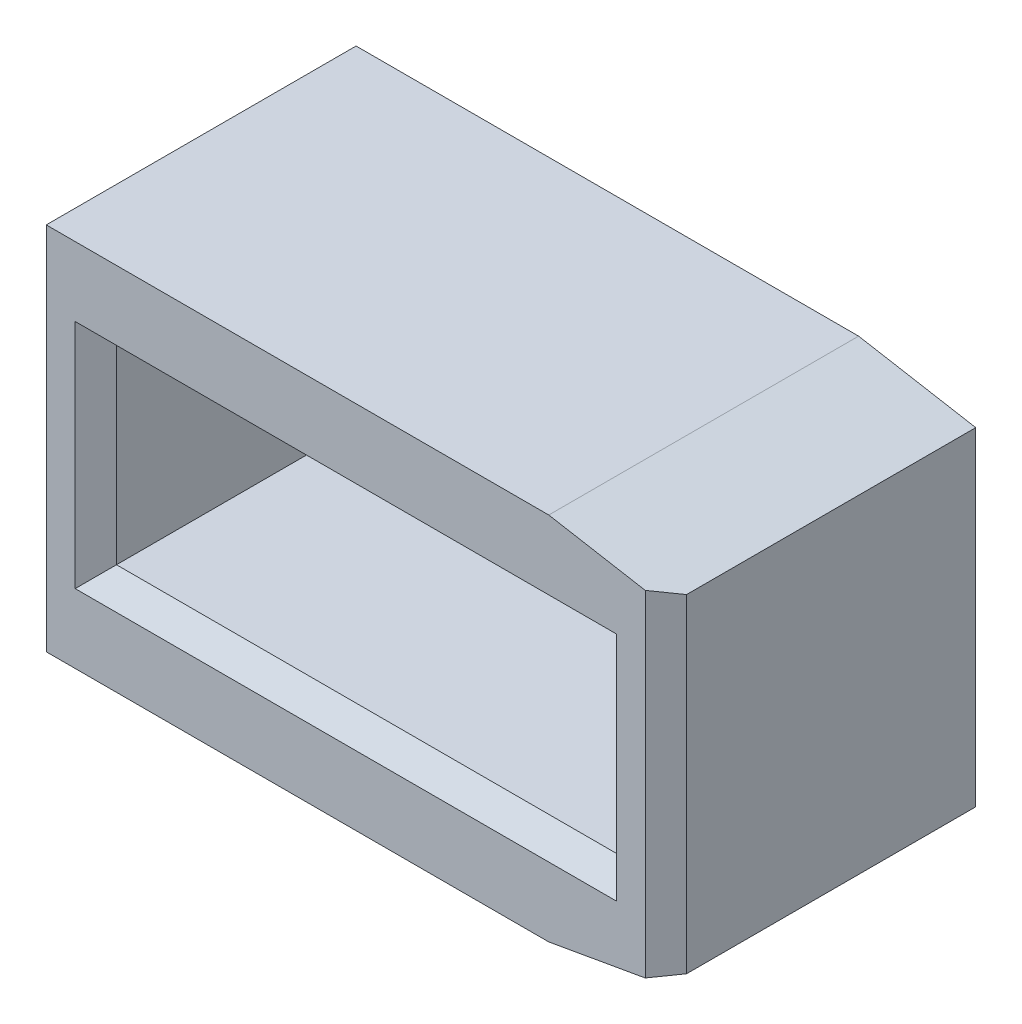
ISO-10303-21;
HEADER;
FILE_DESCRIPTION(('STEP AP214'),'2;1');
FILE_NAME('part.step','',(''),(''),'','','');
FILE_SCHEMA(('AUTOMOTIVE_DESIGN { 1 0 10303 214 1 1 1 1 }'));
ENDSEC;
DATA;
#1=APPLICATION_CONTEXT('core data for automotive mechanical design processes');
#2=APPLICATION_PROTOCOL_DEFINITION('international standard','automotive_design',2000,#1);
#3=PRODUCT_CONTEXT('',#1,'mechanical');
#4=PRODUCT('Part','Part','',(#3));
#5=PRODUCT_RELATED_PRODUCT_CATEGORY('part','',(#4));
#6=PRODUCT_DEFINITION_FORMATION('','',#4);
#7=PRODUCT_DEFINITION_CONTEXT('part definition',#1,'design');
#8=PRODUCT_DEFINITION('design','',#6,#7);
#9=PRODUCT_DEFINITION_SHAPE('','',#8);
#10=(LENGTH_UNIT() NAMED_UNIT(*) SI_UNIT(.MILLI.,.METRE.));
#11=(NAMED_UNIT(*) PLANE_ANGLE_UNIT() SI_UNIT($,.RADIAN.));
#12=(NAMED_UNIT(*) SI_UNIT($,.STERADIAN.) SOLID_ANGLE_UNIT());
#13=UNCERTAINTY_MEASURE_WITH_UNIT(LENGTH_MEASURE(1.E-05),#10,'distance_accuracy_value','');
#14=(GEOMETRIC_REPRESENTATION_CONTEXT(3) GLOBAL_UNCERTAINTY_ASSIGNED_CONTEXT((#13)) GLOBAL_UNIT_ASSIGNED_CONTEXT((#10,
#11,#12)) REPRESENTATION_CONTEXT('',''));
#15=CARTESIAN_POINT('',(0.,0.,0.));
#16=DIRECTION('',(0.,0.,1.));
#17=DIRECTION('',(1.,0.,0.));
#18=AXIS2_PLACEMENT_3D('',#15,#16,#17);
#19=CARTESIAN_POINT('',(30.,17.9,30.));
#20=DIRECTION('',(-1.,0.,0.));
#21=DIRECTION('',(0.,0.,1.));
#22=AXIS2_PLACEMENT_3D('',#19,#20,#21);
#23=PLANE('',#22);
#24=DIRECTION('',(0.,0.,1.));
#25=VECTOR('',#24,1.);
#26=CARTESIAN_POINT('',(30.,15.9,30.));
#27=LINE('',#26,#25);
#28=CARTESIAN_POINT('',(30.,15.9,0.));
#29=VERTEX_POINT('',#28);
#30=CARTESIAN_POINT('',(30.,15.9,28.));
#31=VERTEX_POINT('',#30);
#32=EDGE_CURVE('E215',#29,#31,#27,.T.);
#33=ORIENTED_EDGE('',*,*,#32,.T.);
#34=DIRECTION('',(0.,-1.,0.));
#35=VECTOR('',#34,1.);
#36=CARTESIAN_POINT('',(30.,-15.9,28.));
#37=LINE('',#36,#35);
#38=CARTESIAN_POINT('',(30.,-15.9,28.));
#39=VERTEX_POINT('',#38);
#40=EDGE_CURVE('E57',#31,#39,#37,.T.);
#41=ORIENTED_EDGE('',*,*,#40,.T.);
#42=DIRECTION('',(0.,0.,-1.));
#43=VECTOR('',#42,1.);
#44=CARTESIAN_POINT('',(30.,-15.9,30.));
#45=LINE('',#44,#43);
#46=CARTESIAN_POINT('',(30.,-15.9,0.));
#47=VERTEX_POINT('',#46);
#48=EDGE_CURVE('E218',#39,#47,#45,.T.);
#49=ORIENTED_EDGE('',*,*,#48,.T.);
#50=DIRECTION('',(0.,1.,0.));
#51=VECTOR('',#50,1.);
#52=CARTESIAN_POINT('',(30.,17.9,0.));
#53=LINE('',#52,#51);
#54=EDGE_CURVE('E177',#47,#29,#53,.T.);
#55=ORIENTED_EDGE('',*,*,#54,.T.);
#56=EDGE_LOOP('',(#33,#41,#49,#55));
#57=FACE_BOUND('',#56,.T.);
#58=ADVANCED_FACE('F39',(#57),#23,.F.);
#59=CARTESIAN_POINT('',(-30.,17.9,30.));
#60=DIRECTION('',(0.,-1.,0.));
#61=DIRECTION('',(0.,0.,-1.));
#62=AXIS2_PLACEMENT_3D('',#59,#60,#61);
#63=PLANE('',#62);
#64=DIRECTION('',(-1.,0.,0.));
#65=VECTOR('',#64,1.);
#66=CARTESIAN_POINT('',(-30.,17.9,30.));
#67=LINE('',#66,#65);
#68=CARTESIAN_POINT('',(18.6574363607646,17.9,30.));
#69=VERTEX_POINT('',#68);
#70=CARTESIAN_POINT('',(-30.,17.9,30.));
#71=VERTEX_POINT('',#70);
#72=EDGE_CURVE('E184',#69,#71,#67,.T.);
#73=ORIENTED_EDGE('',*,*,#72,.F.);
#74=DIRECTION('',(0.,0.,-1.));
#75=VECTOR('',#74,1.);
#76=CARTESIAN_POINT('',(18.6574363607646,17.9,30.));
#77=LINE('',#76,#75);
#78=CARTESIAN_POINT('',(18.6574363607646,17.9,0.));
#79=VERTEX_POINT('',#78);
#80=EDGE_CURVE('E237',#69,#79,#77,.T.);
#81=ORIENTED_EDGE('',*,*,#80,.T.);
#82=DIRECTION('',(-1.,0.,0.));
#83=VECTOR('',#82,1.);
#84=CARTESIAN_POINT('',(-30.,17.9,0.));
#85=LINE('',#84,#83);
#86=CARTESIAN_POINT('',(-30.,17.9,0.));
#87=VERTEX_POINT('',#86);
#88=EDGE_CURVE('E199',#79,#87,#85,.T.);
#89=ORIENTED_EDGE('',*,*,#88,.T.);
#90=DIRECTION('',(0.,0.,-1.));
#91=VECTOR('',#90,1.);
#92=CARTESIAN_POINT('',(-30.,17.9,30.));
#93=LINE('',#92,#91);
#94=EDGE_CURVE('E211',#71,#87,#93,.T.);
#95=ORIENTED_EDGE('',*,*,#94,.F.);
#96=EDGE_LOOP('',(#73,#81,#89,#95));
#97=FACE_BOUND('',#96,.T.);
#98=ADVANCED_FACE('F309',(#97),#63,.F.);
#99=CARTESIAN_POINT('',(-30.,17.9,30.));
#100=DIRECTION('',(1.,0.,0.));
#101=DIRECTION('',(0.,0.,-1.));
#102=AXIS2_PLACEMENT_3D('',#99,#100,#101);
#103=PLANE('',#102);
#104=DIRECTION('',(0.,-1.,0.));
#105=VECTOR('',#104,1.);
#106=CARTESIAN_POINT('',(-30.,17.9,0.));
#107=LINE('',#106,#105);
#108=CARTESIAN_POINT('',(-30.,-17.9,0.));
#109=VERTEX_POINT('',#108);
#110=EDGE_CURVE('E202',#87,#109,#107,.T.);
#111=ORIENTED_EDGE('',*,*,#110,.T.);
#112=DIRECTION('',(0.,0.,-1.));
#113=VECTOR('',#112,1.);
#114=CARTESIAN_POINT('',(-30.,-17.9,30.));
#115=LINE('',#114,#113);
#116=CARTESIAN_POINT('',(-30.,-17.9,30.));
#117=VERTEX_POINT('',#116);
#118=EDGE_CURVE('E195',#117,#109,#115,.T.);
#119=ORIENTED_EDGE('',*,*,#118,.F.);
#120=DIRECTION('',(0.,-1.,0.));
#121=VECTOR('',#120,1.);
#122=CARTESIAN_POINT('',(-30.,17.9,30.));
#123=LINE('',#122,#121);
#124=EDGE_CURVE('E187',#71,#117,#123,.T.);
#125=ORIENTED_EDGE('',*,*,#124,.F.);
#126=ORIENTED_EDGE('',*,*,#94,.T.);
#127=EDGE_LOOP('',(#111,#119,#125,#126));
#128=FACE_BOUND('',#127,.T.);
#129=ADVANCED_FACE('F314',(#128),#103,.F.);
#130=CARTESIAN_POINT('',(-30.,-17.9,30.));
#131=DIRECTION('',(0.,1.,0.));
#132=DIRECTION('',(0.,0.,1.));
#133=AXIS2_PLACEMENT_3D('',#130,#131,#132);
#134=PLANE('',#133);
#135=DIRECTION('',(1.,0.,0.));
#136=VECTOR('',#135,1.);
#137=CARTESIAN_POINT('',(-30.,-17.9,0.));
#138=LINE('',#137,#136);
#139=CARTESIAN_POINT('',(18.6574363607646,-17.9,0.));
#140=VERTEX_POINT('',#139);
#141=EDGE_CURVE('E188',#109,#140,#138,.T.);
#142=ORIENTED_EDGE('',*,*,#141,.T.);
#143=DIRECTION('',(0.,0.,1.));
#144=VECTOR('',#143,1.);
#145=CARTESIAN_POINT('',(18.6574363607646,-17.9,30.));
#146=LINE('',#145,#144);
#147=CARTESIAN_POINT('',(18.6574363607646,-17.9,30.));
#148=VERTEX_POINT('',#147);
#149=EDGE_CURVE('E227',#140,#148,#146,.T.);
#150=ORIENTED_EDGE('',*,*,#149,.T.);
#151=DIRECTION('',(1.,0.,0.));
#152=VECTOR('',#151,1.);
#153=CARTESIAN_POINT('',(-30.,-17.9,30.));
#154=LINE('',#153,#152);
#155=EDGE_CURVE('E191',#117,#148,#154,.T.);
#156=ORIENTED_EDGE('',*,*,#155,.F.);
#157=ORIENTED_EDGE('',*,*,#118,.T.);
#158=EDGE_LOOP('',(#142,#150,#156,#157));
#159=FACE_BOUND('',#158,.T.);
#160=ADVANCED_FACE('F401',(#159),#134,.F.);
#161=CARTESIAN_POINT('',(0.,0.,30.));
#162=DIRECTION('',(0.,0.,1.));
#163=DIRECTION('',(1.,0.,0.));
#164=AXIS2_PLACEMENT_3D('',#161,#162,#163);
#165=PLANE('',#164);
#166=DIRECTION('',(0.,1.,0.));
#167=VECTOR('',#166,1.);
#168=CARTESIAN_POINT('',(25.2,-9.19999999999999,30.));
#169=LINE('',#168,#167);
#170=CARTESIAN_POINT('',(25.2,-11.2,30.));
#171=VERTEX_POINT('',#170);
#172=CARTESIAN_POINT('',(25.2,11.2,30.));
#173=VERTEX_POINT('',#172);
#174=EDGE_CURVE('E165',#171,#173,#169,.T.);
#175=ORIENTED_EDGE('',*,*,#174,.F.);
#176=DIRECTION('',(-1.,0.,0.));
#177=VECTOR('',#176,1.);
#178=CARTESIAN_POINT('',(-25.2,-11.2,30.));
#179=LINE('',#178,#177);
#180=CARTESIAN_POINT('',(-27.2,-11.2,30.));
#181=VERTEX_POINT('',#180);
#182=EDGE_CURVE('E256',#171,#181,#179,.T.);
#183=ORIENTED_EDGE('',*,*,#182,.T.);
#184=DIRECTION('',(0.,1.,0.));
#185=VECTOR('',#184,1.);
#186=CARTESIAN_POINT('',(-27.2,9.19999999999999,30.));
#187=LINE('',#186,#185);
#188=CARTESIAN_POINT('',(-27.2,11.2,30.));
#189=VERTEX_POINT('',#188);
#190=EDGE_CURVE('E253',#181,#189,#187,.T.);
#191=ORIENTED_EDGE('',*,*,#190,.T.);
#192=DIRECTION('',(1.,0.,0.));
#193=VECTOR('',#192,1.);
#194=CARTESIAN_POINT('',(25.2,11.2,30.));
#195=LINE('',#194,#193);
#196=EDGE_CURVE('E249',#189,#173,#195,.T.);
#197=ORIENTED_EDGE('',*,*,#196,.T.);
#198=EDGE_LOOP('',(#175,#183,#191,#197));
#199=FACE_BOUND('',#198,.T.);
#200=DIRECTION('',(-0.984807753012208,-0.173648177666931,0.));
#201=VECTOR('',#200,1.);
#202=CARTESIAN_POINT('',(3.62367082765046,-20.550858485133,30.));
#203=LINE('',#202,#201);
#204=CARTESIAN_POINT('',(28.,-16.2526539614169,30.));
#205=VERTEX_POINT('',#204);
#206=EDGE_CURVE('E233',#148,#205,#203,.F.);
#207=ORIENTED_EDGE('',*,*,#206,.T.);
#208=DIRECTION('',(0.,1.,0.));
#209=VECTOR('',#208,1.);
#210=CARTESIAN_POINT('',(28.,15.9,30.));
#211=LINE('',#210,#209);
#212=CARTESIAN_POINT('',(28.,16.2526539614169,30.));
#213=VERTEX_POINT('',#212);
#214=EDGE_CURVE('E245',#205,#213,#211,.T.);
#215=ORIENTED_EDGE('',*,*,#214,.T.);
#216=DIRECTION('',(0.984807753012208,-0.173648177666931,0.));
#217=VECTOR('',#216,1.);
#218=CARTESIAN_POINT('',(3.62367082765045,20.550858485133,30.));
#219=LINE('',#218,#217);
#220=EDGE_CURVE('E230',#213,#69,#219,.F.);
#221=ORIENTED_EDGE('',*,*,#220,.T.);
#222=ORIENTED_EDGE('',*,*,#72,.T.);
#223=ORIENTED_EDGE('',*,*,#124,.T.);
#224=ORIENTED_EDGE('',*,*,#155,.T.);
#225=EDGE_LOOP('',(#207,#215,#221,#222,#223,#224));
#226=FACE_BOUND('',#225,.T.);
#227=ADVANCED_FACE('F292',(#199,#226),#165,.T.);
#228=CARTESIAN_POINT('',(0.,0.,0.));
#229=DIRECTION('',(0.,0.,1.));
#230=DIRECTION('',(1.,0.,0.));
#231=AXIS2_PLACEMENT_3D('',#228,#229,#230);
#232=PLANE('',#231);
#233=DIRECTION('',(1.,0.,0.));
#234=VECTOR('',#233,1.);
#235=CARTESIAN_POINT('',(-25.2,-9.2,0.));
#236=LINE('',#235,#234);
#237=CARTESIAN_POINT('',(-25.2,-9.2,0.));
#238=VERTEX_POINT('',#237);
#239=CARTESIAN_POINT('',(25.2,-9.19999999999999,0.));
#240=VERTEX_POINT('',#239);
#241=EDGE_CURVE('E149',#238,#240,#236,.T.);
#242=ORIENTED_EDGE('',*,*,#241,.T.);
#243=DIRECTION('',(0.,1.,0.));
#244=VECTOR('',#243,1.);
#245=CARTESIAN_POINT('',(25.2,-9.19999999999999,0.));
#246=LINE('',#245,#244);
#247=CARTESIAN_POINT('',(25.2,9.19999999999999,0.));
#248=VERTEX_POINT('',#247);
#249=EDGE_CURVE('E142',#240,#248,#246,.T.);
#250=ORIENTED_EDGE('',*,*,#249,.T.);
#251=DIRECTION('',(-1.,0.,0.));
#252=VECTOR('',#251,1.);
#253=CARTESIAN_POINT('',(-25.2,9.19999999999999,0.));
#254=LINE('',#253,#252);
#255=CARTESIAN_POINT('',(-25.2,9.19999999999999,0.));
#256=VERTEX_POINT('',#255);
#257=EDGE_CURVE('E153',#248,#256,#254,.T.);
#258=ORIENTED_EDGE('',*,*,#257,.T.);
#259=DIRECTION('',(0.,-1.,0.));
#260=VECTOR('',#259,1.);
#261=CARTESIAN_POINT('',(-25.2,-9.2,0.));
#262=LINE('',#261,#260);
#263=EDGE_CURVE('E159',#256,#238,#262,.T.);
#264=ORIENTED_EDGE('',*,*,#263,.T.);
#265=EDGE_LOOP('',(#242,#250,#258,#264));
#266=FACE_BOUND('',#265,.T.);
#267=ORIENTED_EDGE('',*,*,#54,.F.);
#268=DIRECTION('',(0.984807753012208,0.173648177666931,0.));
#269=VECTOR('',#268,1.);
#270=CARTESIAN_POINT('',(30.,-15.9,0.));
#271=LINE('',#270,#269);
#272=EDGE_CURVE('E224',#47,#140,#271,.F.);
#273=ORIENTED_EDGE('',*,*,#272,.T.);
#274=ORIENTED_EDGE('',*,*,#141,.F.);
#275=ORIENTED_EDGE('',*,*,#110,.F.);
#276=ORIENTED_EDGE('',*,*,#88,.F.);
#277=DIRECTION('',(-0.984807753012208,0.173648177666931,0.));
#278=VECTOR('',#277,1.);
#279=CARTESIAN_POINT('',(18.6574363607646,17.9,0.));
#280=LINE('',#279,#278);
#281=EDGE_CURVE('E221',#79,#29,#280,.F.);
#282=ORIENTED_EDGE('',*,*,#281,.T.);
#283=EDGE_LOOP('',(#267,#273,#274,#275,#276,#282));
#284=FACE_BOUND('',#283,.T.);
#285=ADVANCED_FACE('F161',(#266,#284),#232,.F.);
#286=CARTESIAN_POINT('',(25.2,-9.19999999999999,0.));
#287=DIRECTION('',(1.,0.,0.));
#288=DIRECTION('',(0.,0.,-1.));
#289=AXIS2_PLACEMENT_3D('',#286,#287,#288);
#290=PLANE('',#289);
#291=ORIENTED_EDGE('',*,*,#174,.T.);
#292=DIRECTION('',(0.,-0.707106781186549,-0.707106781186546));
#293=VECTOR('',#292,1.);
#294=CARTESIAN_POINT('',(25.2,-14.,4.80000000000005));
#295=LINE('',#294,#293);
#296=CARTESIAN_POINT('',(25.2,9.19999999999999,28.));
#297=VERTEX_POINT('',#296);
#298=EDGE_CURVE('E11',#173,#297,#295,.T.);
#299=ORIENTED_EDGE('',*,*,#298,.T.);
#300=DIRECTION('',(0.,0.,1.));
#301=VECTOR('',#300,1.);
#302=CARTESIAN_POINT('',(25.2,9.19999999999999,0.));
#303=LINE('',#302,#301);
#304=EDGE_CURVE('E137',#248,#297,#303,.T.);
#305=ORIENTED_EDGE('',*,*,#304,.F.);
#306=ORIENTED_EDGE('',*,*,#249,.F.);
#307=DIRECTION('',(0.,0.,1.));
#308=VECTOR('',#307,1.);
#309=CARTESIAN_POINT('',(25.2,-9.19999999999999,0.));
#310=LINE('',#309,#308);
#311=CARTESIAN_POINT('',(25.2,-9.19999999999999,28.));
#312=VERTEX_POINT('',#311);
#313=EDGE_CURVE('E174',#240,#312,#310,.T.);
#314=ORIENTED_EDGE('',*,*,#313,.T.);
#315=DIRECTION('',(0.,-0.707106781186549,0.707106781186546));
#316=VECTOR('',#315,1.);
#317=CARTESIAN_POINT('',(25.2,4.8,14.));
#318=LINE('',#317,#316);
#319=EDGE_CURVE('E49',#312,#171,#318,.T.);
#320=ORIENTED_EDGE('',*,*,#319,.T.);
#321=EDGE_LOOP('',(#291,#299,#305,#306,#314,#320));
#322=FACE_BOUND('',#321,.T.);
#323=ADVANCED_FACE('F139',(#322),#290,.F.);
#324=CARTESIAN_POINT('',(-25.2,-9.2,0.));
#325=DIRECTION('',(0.,-1.,0.));
#326=DIRECTION('',(1.,0.,0.));
#327=AXIS2_PLACEMENT_3D('',#324,#325,#326);
#328=PLANE('',#327);
#329=DIRECTION('',(0.,0.,1.));
#330=VECTOR('',#329,1.);
#331=CARTESIAN_POINT('',(-25.2,-9.2,0.));
#332=LINE('',#331,#330);
#333=CARTESIAN_POINT('',(-25.2,-9.2,28.));
#334=VERTEX_POINT('',#333);
#335=EDGE_CURVE('E178',#238,#334,#332,.T.);
#336=ORIENTED_EDGE('',*,*,#335,.T.);
#337=DIRECTION('',(1.,0.,0.));
#338=VECTOR('',#337,1.);
#339=CARTESIAN_POINT('',(25.2,-9.19999999999999,28.));
#340=LINE('',#339,#338);
#341=EDGE_CURVE('E241',#334,#312,#340,.T.);
#342=ORIENTED_EDGE('',*,*,#341,.T.);
#343=ORIENTED_EDGE('',*,*,#313,.F.);
#344=ORIENTED_EDGE('',*,*,#241,.F.);
#345=EDGE_LOOP('',(#336,#342,#343,#344));
#346=FACE_BOUND('',#345,.T.);
#347=ADVANCED_FACE('F296',(#346),#328,.F.);
#348=CARTESIAN_POINT('',(-25.2,-9.2,0.));
#349=DIRECTION('',(-1.,0.,0.));
#350=DIRECTION('',(0.,-1.,0.));
#351=AXIS2_PLACEMENT_3D('',#348,#349,#350);
#352=PLANE('',#351);
#353=DIRECTION('',(0.,0.,1.));
#354=VECTOR('',#353,1.);
#355=CARTESIAN_POINT('',(-25.2,9.19999999999999,0.));
#356=LINE('',#355,#354);
#357=CARTESIAN_POINT('',(-25.2,9.19999999999999,28.));
#358=VERTEX_POINT('',#357);
#359=EDGE_CURVE('E148',#256,#358,#356,.T.);
#360=ORIENTED_EDGE('',*,*,#359,.T.);
#361=DIRECTION('',(0.,-1.,0.));
#362=VECTOR('',#361,1.);
#363=CARTESIAN_POINT('',(-25.2,-9.2,28.));
#364=LINE('',#363,#362);
#365=EDGE_CURVE('E259',#358,#334,#364,.T.);
#366=ORIENTED_EDGE('',*,*,#365,.T.);
#367=ORIENTED_EDGE('',*,*,#335,.F.);
#368=ORIENTED_EDGE('',*,*,#263,.F.);
#369=EDGE_LOOP('',(#360,#366,#367,#368));
#370=FACE_BOUND('',#369,.T.);
#371=ADVANCED_FACE('F298',(#370),#352,.F.);
#372=CARTESIAN_POINT('',(-25.2,9.19999999999999,0.));
#373=DIRECTION('',(0.,1.,0.));
#374=DIRECTION('',(-1.,0.,0.));
#375=AXIS2_PLACEMENT_3D('',#372,#373,#374);
#376=PLANE('',#375);
#377=ORIENTED_EDGE('',*,*,#304,.T.);
#378=DIRECTION('',(-1.,0.,0.));
#379=VECTOR('',#378,1.);
#380=CARTESIAN_POINT('',(-25.2,9.19999999999999,28.));
#381=LINE('',#380,#379);
#382=EDGE_CURVE('E262',#297,#358,#381,.T.);
#383=ORIENTED_EDGE('',*,*,#382,.T.);
#384=ORIENTED_EDGE('',*,*,#359,.F.);
#385=ORIENTED_EDGE('',*,*,#257,.F.);
#386=EDGE_LOOP('',(#377,#383,#384,#385));
#387=FACE_BOUND('',#386,.T.);
#388=ADVANCED_FACE('F154',(#387),#376,.F.);
#389=CARTESIAN_POINT('',(30.,-15.9,30.));
#390=DIRECTION('',(-0.173648177666931,0.984807753012208,0.));
#391=DIRECTION('',(0.,0.,-1.));
#392=AXIS2_PLACEMENT_3D('',#389,#390,#391);
#393=PLANE('',#392);
#394=ORIENTED_EDGE('',*,*,#48,.F.);
#395=DIRECTION('',(0.701673843159862,0.123724030206484,-0.701673843159865));
#396=VECTOR('',#395,1.);
#397=CARTESIAN_POINT('',(29.0153076356505,-16.0736278315324,28.9846923643495));
#398=LINE('',#397,#396);
#399=EDGE_CURVE('E269',#39,#205,#398,.F.);
#400=ORIENTED_EDGE('',*,*,#399,.T.);
#401=ORIENTED_EDGE('',*,*,#206,.F.);
#402=ORIENTED_EDGE('',*,*,#149,.F.);
#403=ORIENTED_EDGE('',*,*,#272,.F.);
#404=EDGE_LOOP('',(#394,#400,#401,#402,#403));
#405=FACE_BOUND('',#404,.T.);
#406=ADVANCED_FACE('F305',(#405),#393,.F.);
#407=CARTESIAN_POINT('',(18.6574363607646,17.9,30.));
#408=DIRECTION('',(-0.173648177666931,-0.984807753012208,0.));
#409=DIRECTION('',(0.,0.,-1.));
#410=AXIS2_PLACEMENT_3D('',#407,#408,#409);
#411=PLANE('',#410);
#412=ORIENTED_EDGE('',*,*,#220,.F.);
#413=DIRECTION('',(-0.701673843159862,0.123724030206484,0.701673843159865));
#414=VECTOR('',#413,1.);
#415=CARTESIAN_POINT('',(23.2572119002666,17.0889354671829,34.7427880997334));
#416=LINE('',#415,#414);
#417=EDGE_CURVE('E65',#213,#31,#416,.F.);
#418=ORIENTED_EDGE('',*,*,#417,.T.);
#419=ORIENTED_EDGE('',*,*,#32,.F.);
#420=ORIENTED_EDGE('',*,*,#281,.F.);
#421=ORIENTED_EDGE('',*,*,#80,.F.);
#422=EDGE_LOOP('',(#412,#418,#419,#420,#421));
#423=FACE_BOUND('',#422,.T.);
#424=ADVANCED_FACE('F321',(#423),#411,.F.);
#425=CARTESIAN_POINT('',(-25.2,9.19999999999999,28.));
#426=DIRECTION('',(0.,-0.707106781186546,0.707106781186549));
#427=DIRECTION('',(1.,0.,0.));
#428=AXIS2_PLACEMENT_3D('',#425,#426,#427);
#429=PLANE('',#428);
#430=ORIENTED_EDGE('',*,*,#298,.F.);
#431=ORIENTED_EDGE('',*,*,#196,.F.);
#432=DIRECTION('',(0.577350269189627,-0.577350269189626,-0.577350269189624));
#433=VECTOR('',#432,1.);
#434=CARTESIAN_POINT('',(-19.0666666666667,3.06666666666664,21.8666666666667));
#435=LINE('',#434,#433);
#436=EDGE_CURVE('E43',#358,#189,#435,.F.);
#437=ORIENTED_EDGE('',*,*,#436,.F.);
#438=ORIENTED_EDGE('',*,*,#382,.F.);
#439=EDGE_LOOP('',(#430,#431,#437,#438));
#440=FACE_BOUND('',#439,.T.);
#441=ADVANCED_FACE('F290',(#440),#429,.T.);
#442=CARTESIAN_POINT('',(-25.2,-9.2,28.));
#443=DIRECTION('',(0.707106781186546,0.,0.707106781186549));
#444=DIRECTION('',(0.,1.,0.));
#445=AXIS2_PLACEMENT_3D('',#442,#443,#444);
#446=PLANE('',#445);
#447=ORIENTED_EDGE('',*,*,#436,.T.);
#448=ORIENTED_EDGE('',*,*,#190,.F.);
#449=DIRECTION('',(0.577350269189626,0.577350269189627,-0.577350269189625));
#450=VECTOR('',#449,1.);
#451=CARTESIAN_POINT('',(-25.2,-9.2,28.));
#452=LINE('',#451,#450);
#453=EDGE_CURVE('E274',#334,#181,#452,.F.);
#454=ORIENTED_EDGE('',*,*,#453,.F.);
#455=ORIENTED_EDGE('',*,*,#365,.F.);
#456=EDGE_LOOP('',(#447,#448,#454,#455));
#457=FACE_BOUND('',#456,.T.);
#458=ADVANCED_FACE('F287',(#457),#446,.T.);
#459=CARTESIAN_POINT('',(-25.2,-9.2,28.));
#460=DIRECTION('',(0.,0.707106781186546,0.707106781186549));
#461=DIRECTION('',(-1.,0.,0.));
#462=AXIS2_PLACEMENT_3D('',#459,#460,#461);
#463=PLANE('',#462);
#464=ORIENTED_EDGE('',*,*,#453,.T.);
#465=ORIENTED_EDGE('',*,*,#182,.F.);
#466=ORIENTED_EDGE('',*,*,#319,.F.);
#467=ORIENTED_EDGE('',*,*,#341,.F.);
#468=EDGE_LOOP('',(#464,#465,#466,#467));
#469=FACE_BOUND('',#468,.T.);
#470=ADVANCED_FACE('F294',(#469),#463,.T.);
#471=CARTESIAN_POINT('',(28.,0.,30.));
#472=DIRECTION('',(0.707106781186549,0.,0.707106781186546));
#473=DIRECTION('',(0.,-1.,0.));
#474=AXIS2_PLACEMENT_3D('',#471,#472,#473);
#475=PLANE('',#474);
#476=ORIENTED_EDGE('',*,*,#399,.F.);
#477=ORIENTED_EDGE('',*,*,#40,.F.);
#478=ORIENTED_EDGE('',*,*,#417,.F.);
#479=ORIENTED_EDGE('',*,*,#214,.F.);
#480=EDGE_LOOP('',(#476,#477,#478,#479));
#481=FACE_BOUND('',#480,.T.);
#482=ADVANCED_FACE('F41',(#481),#475,.T.);
#483=CLOSED_SHELL('',(#58,#98,#129,#160,#227,#285,#323,#347,#371,#388,#406,#424,#441,#458,#470,#482));
#484=MANIFOLD_SOLID_BREP('B2',#483);
#485=ADVANCED_BREP_SHAPE_REPRESENTATION('',(#18,#484),#14);
#486=SHAPE_DEFINITION_REPRESENTATION(#9,#485);
ENDSEC;
END-ISO-10303-21;
